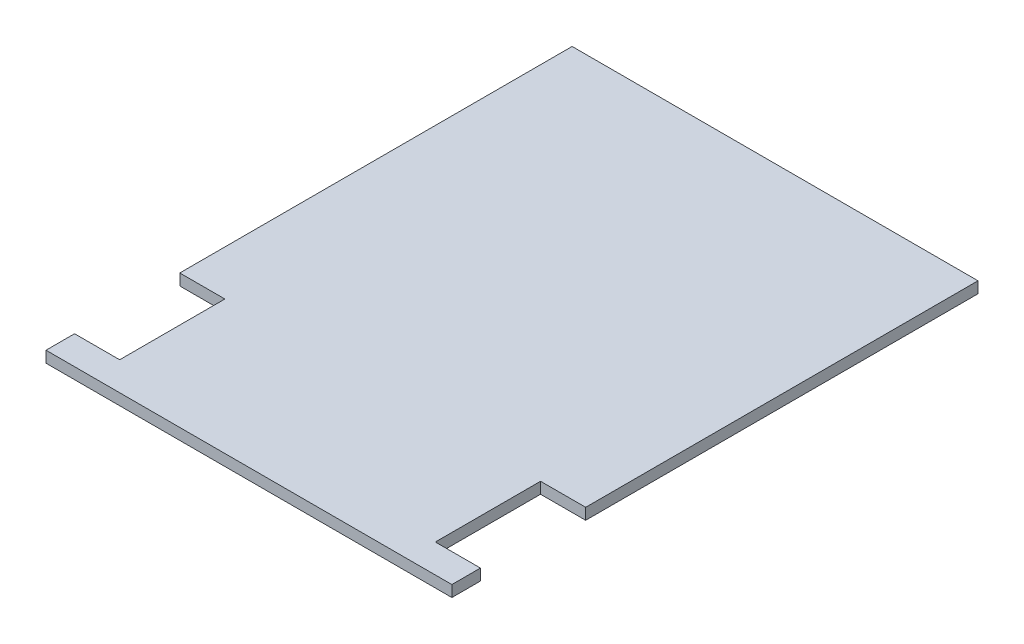
ISO-10303-21;
HEADER;
FILE_DESCRIPTION(('STEP AP214'),'2;1');
FILE_NAME('part.step','',(''),(''),'','','');
FILE_SCHEMA(('AUTOMOTIVE_DESIGN { 1 0 10303 214 1 1 1 1 }'));
ENDSEC;
DATA;
#1=APPLICATION_CONTEXT('core data for automotive mechanical design processes');
#2=APPLICATION_PROTOCOL_DEFINITION('international standard','automotive_design',2000,#1);
#3=PRODUCT_CONTEXT('',#1,'mechanical');
#4=PRODUCT('Part','Part','',(#3));
#5=PRODUCT_RELATED_PRODUCT_CATEGORY('part','',(#4));
#6=PRODUCT_DEFINITION_FORMATION('','',#4);
#7=PRODUCT_DEFINITION_CONTEXT('part definition',#1,'design');
#8=PRODUCT_DEFINITION('design','',#6,#7);
#9=PRODUCT_DEFINITION_SHAPE('','',#8);
#10=(LENGTH_UNIT() NAMED_UNIT(*) SI_UNIT(.MILLI.,.METRE.));
#11=(NAMED_UNIT(*) PLANE_ANGLE_UNIT() SI_UNIT($,.RADIAN.));
#12=(NAMED_UNIT(*) SI_UNIT($,.STERADIAN.) SOLID_ANGLE_UNIT());
#13=UNCERTAINTY_MEASURE_WITH_UNIT(LENGTH_MEASURE(1.E-05),#10,'distance_accuracy_value','');
#14=(GEOMETRIC_REPRESENTATION_CONTEXT(3) GLOBAL_UNCERTAINTY_ASSIGNED_CONTEXT((#13)) GLOBAL_UNIT_ASSIGNED_CONTEXT((#10,
#11,#12)) REPRESENTATION_CONTEXT('',''));
#15=CARTESIAN_POINT('',(0.,0.,0.));
#16=DIRECTION('',(0.,0.,1.));
#17=DIRECTION('',(1.,0.,0.));
#18=AXIS2_PLACEMENT_3D('',#15,#16,#17);
#19=CARTESIAN_POINT('',(-19.3852350722264,0.75,-1.9));
#20=DIRECTION('',(1.,0.,0.));
#21=DIRECTION('',(0.,0.,-1.));
#22=AXIS2_PLACEMENT_3D('',#19,#20,#21);
#23=PLANE('',#22);
#24=DIRECTION('',(0.,0.,1.));
#25=VECTOR('',#24,1.);
#26=CARTESIAN_POINT('',(-19.3852350722264,0.,-1.9));
#27=LINE('',#26,#25);
#28=CARTESIAN_POINT('',(-19.3852350722264,0.,-1.9));
#29=VERTEX_POINT('',#28);
#30=CARTESIAN_POINT('',(-19.3852350722264,0.,0.));
#31=VERTEX_POINT('',#30);
#32=EDGE_CURVE('E153',#29,#31,#27,.T.);
#33=ORIENTED_EDGE('',*,*,#32,.T.);
#34=DIRECTION('',(0.,-1.,0.));
#35=VECTOR('',#34,1.);
#36=CARTESIAN_POINT('',(-19.3852350722264,0.75,0.));
#37=LINE('',#36,#35);
#38=CARTESIAN_POINT('',(-19.3852350722264,0.75,0.));
#39=VERTEX_POINT('',#38);
#40=EDGE_CURVE('E11',#39,#31,#37,.T.);
#41=ORIENTED_EDGE('',*,*,#40,.F.);
#42=DIRECTION('',(0.,0.,1.));
#43=VECTOR('',#42,1.);
#44=CARTESIAN_POINT('',(-19.3852350722264,0.75,-1.9));
#45=LINE('',#44,#43);
#46=CARTESIAN_POINT('',(-19.3852350722264,0.75,-1.9));
#47=VERTEX_POINT('',#46);
#48=EDGE_CURVE('E175',#47,#39,#45,.T.);
#49=ORIENTED_EDGE('',*,*,#48,.F.);
#50=DIRECTION('',(0.,-1.,0.));
#51=VECTOR('',#50,1.);
#52=CARTESIAN_POINT('',(-19.3852350722264,0.75,-1.9));
#53=LINE('',#52,#51);
#54=EDGE_CURVE('E149',#47,#29,#53,.T.);
#55=ORIENTED_EDGE('',*,*,#54,.T.);
#56=EDGE_LOOP('',(#33,#41,#49,#55));
#57=FACE_BOUND('',#56,.T.);
#58=ADVANCED_FACE('F33',(#57),#23,.F.);
#59=CARTESIAN_POINT('',(7.61476492777361,0.75,0.));
#60=DIRECTION('',(0.,0.,-1.));
#61=DIRECTION('',(-1.,0.,0.));
#62=AXIS2_PLACEMENT_3D('',#59,#60,#61);
#63=PLANE('',#62);
#64=DIRECTION('',(1.,0.,0.));
#65=VECTOR('',#64,1.);
#66=CARTESIAN_POINT('',(7.61476492777361,0.,0.));
#67=LINE('',#66,#65);
#68=CARTESIAN_POINT('',(7.61476492777361,0.,0.));
#69=VERTEX_POINT('',#68);
#70=EDGE_CURVE('E156',#31,#69,#67,.T.);
#71=ORIENTED_EDGE('',*,*,#70,.T.);
#72=DIRECTION('',(0.,-1.,0.));
#73=VECTOR('',#72,1.);
#74=CARTESIAN_POINT('',(7.61476492777361,0.75,0.));
#75=LINE('',#74,#73);
#76=CARTESIAN_POINT('',(7.61476492777361,0.75,0.));
#77=VERTEX_POINT('',#76);
#78=EDGE_CURVE('E41',#77,#69,#75,.T.);
#79=ORIENTED_EDGE('',*,*,#78,.F.);
#80=DIRECTION('',(1.,0.,0.));
#81=VECTOR('',#80,1.);
#82=CARTESIAN_POINT('',(7.61476492777361,0.75,0.));
#83=LINE('',#82,#81);
#84=EDGE_CURVE('E104',#39,#77,#83,.T.);
#85=ORIENTED_EDGE('',*,*,#84,.F.);
#86=ORIENTED_EDGE('',*,*,#40,.T.);
#87=EDGE_LOOP('',(#71,#79,#85,#86));
#88=FACE_BOUND('',#87,.T.);
#89=ADVANCED_FACE('F253',(#88),#63,.F.);
#90=CARTESIAN_POINT('',(7.61476492777361,0.75,-1.9));
#91=DIRECTION('',(-1.,0.,0.));
#92=DIRECTION('',(0.,0.,1.));
#93=AXIS2_PLACEMENT_3D('',#90,#91,#92);
#94=PLANE('',#93);
#95=DIRECTION('',(0.,0.,-1.));
#96=VECTOR('',#95,1.);
#97=CARTESIAN_POINT('',(7.61476492777361,0.,-1.9));
#98=LINE('',#97,#96);
#99=CARTESIAN_POINT('',(7.61476492777361,0.,-1.9));
#100=VERTEX_POINT('',#99);
#101=EDGE_CURVE('E158',#69,#100,#98,.T.);
#102=ORIENTED_EDGE('',*,*,#101,.T.);
#103=DIRECTION('',(0.,-1.,0.));
#104=VECTOR('',#103,1.);
#105=CARTESIAN_POINT('',(7.61476492777361,0.75,-1.9));
#106=LINE('',#105,#104);
#107=CARTESIAN_POINT('',(7.61476492777361,0.75,-1.9));
#108=VERTEX_POINT('',#107);
#109=EDGE_CURVE('E194',#108,#100,#106,.T.);
#110=ORIENTED_EDGE('',*,*,#109,.F.);
#111=DIRECTION('',(0.,0.,-1.));
#112=VECTOR('',#111,1.);
#113=CARTESIAN_POINT('',(7.61476492777361,0.75,-1.9));
#114=LINE('',#113,#112);
#115=EDGE_CURVE('E202',#77,#108,#114,.T.);
#116=ORIENTED_EDGE('',*,*,#115,.F.);
#117=ORIENTED_EDGE('',*,*,#78,.T.);
#118=EDGE_LOOP('',(#102,#110,#116,#117));
#119=FACE_BOUND('',#118,.T.);
#120=ADVANCED_FACE('F200',(#119),#94,.F.);
#121=CARTESIAN_POINT('',(4.61476492777361,0.75,-1.9));
#122=DIRECTION('',(0.,0.,1.));
#123=DIRECTION('',(1.,0.,0.));
#124=AXIS2_PLACEMENT_3D('',#121,#122,#123);
#125=PLANE('',#124);
#126=DIRECTION('',(-1.,0.,0.));
#127=VECTOR('',#126,1.);
#128=CARTESIAN_POINT('',(4.61476492777361,0.,-1.9));
#129=LINE('',#128,#127);
#130=CARTESIAN_POINT('',(4.61476492777361,0.,-1.9));
#131=VERTEX_POINT('',#130);
#132=EDGE_CURVE('E160',#100,#131,#129,.T.);
#133=ORIENTED_EDGE('',*,*,#132,.T.);
#134=DIRECTION('',(0.,-1.,0.));
#135=VECTOR('',#134,1.);
#136=CARTESIAN_POINT('',(4.61476492777361,0.75,-1.9));
#137=LINE('',#136,#135);
#138=CARTESIAN_POINT('',(4.61476492777361,0.75,-1.9));
#139=VERTEX_POINT('',#138);
#140=EDGE_CURVE('E191',#139,#131,#137,.T.);
#141=ORIENTED_EDGE('',*,*,#140,.F.);
#142=DIRECTION('',(-1.,0.,0.));
#143=VECTOR('',#142,1.);
#144=CARTESIAN_POINT('',(4.61476492777361,0.75,-1.9));
#145=LINE('',#144,#143);
#146=EDGE_CURVE('E220',#108,#139,#145,.T.);
#147=ORIENTED_EDGE('',*,*,#146,.F.);
#148=ORIENTED_EDGE('',*,*,#109,.T.);
#149=EDGE_LOOP('',(#133,#141,#147,#148));
#150=FACE_BOUND('',#149,.T.);
#151=ADVANCED_FACE('F211',(#150),#125,.F.);
#152=CARTESIAN_POINT('',(4.61476492777361,0.75,-8.9));
#153=DIRECTION('',(-1.,0.,0.));
#154=DIRECTION('',(0.,0.,1.));
#155=AXIS2_PLACEMENT_3D('',#152,#153,#154);
#156=PLANE('',#155);
#157=DIRECTION('',(0.,0.,-1.));
#158=VECTOR('',#157,1.);
#159=CARTESIAN_POINT('',(4.61476492777361,0.,-8.9));
#160=LINE('',#159,#158);
#161=CARTESIAN_POINT('',(4.61476492777361,0.,-8.9));
#162=VERTEX_POINT('',#161);
#163=EDGE_CURVE('E162',#131,#162,#160,.T.);
#164=ORIENTED_EDGE('',*,*,#163,.T.);
#165=DIRECTION('',(0.,-1.,0.));
#166=VECTOR('',#165,1.);
#167=CARTESIAN_POINT('',(4.61476492777361,0.75,-8.9));
#168=LINE('',#167,#166);
#169=CARTESIAN_POINT('',(4.61476492777361,0.75,-8.9));
#170=VERTEX_POINT('',#169);
#171=EDGE_CURVE('E188',#170,#162,#168,.T.);
#172=ORIENTED_EDGE('',*,*,#171,.F.);
#173=DIRECTION('',(0.,0.,-1.));
#174=VECTOR('',#173,1.);
#175=CARTESIAN_POINT('',(4.61476492777361,0.75,-8.9));
#176=LINE('',#175,#174);
#177=EDGE_CURVE('E217',#139,#170,#176,.T.);
#178=ORIENTED_EDGE('',*,*,#177,.F.);
#179=ORIENTED_EDGE('',*,*,#140,.T.);
#180=EDGE_LOOP('',(#164,#172,#178,#179));
#181=FACE_BOUND('',#180,.T.);
#182=ADVANCED_FACE('F215',(#181),#156,.F.);
#183=CARTESIAN_POINT('',(7.61476492777361,0.75,-8.9));
#184=DIRECTION('',(0.,0.,-1.));
#185=DIRECTION('',(-1.,0.,0.));
#186=AXIS2_PLACEMENT_3D('',#183,#184,#185);
#187=PLANE('',#186);
#188=DIRECTION('',(1.,0.,0.));
#189=VECTOR('',#188,1.);
#190=CARTESIAN_POINT('',(7.61476492777361,0.,-8.9));
#191=LINE('',#190,#189);
#192=CARTESIAN_POINT('',(7.61476492777361,0.,-8.9));
#193=VERTEX_POINT('',#192);
#194=EDGE_CURVE('E164',#162,#193,#191,.T.);
#195=ORIENTED_EDGE('',*,*,#194,.T.);
#196=DIRECTION('',(0.,-1.,0.));
#197=VECTOR('',#196,1.);
#198=CARTESIAN_POINT('',(7.61476492777361,0.75,-8.9));
#199=LINE('',#198,#197);
#200=CARTESIAN_POINT('',(7.61476492777361,0.75,-8.9));
#201=VERTEX_POINT('',#200);
#202=EDGE_CURVE('E185',#201,#193,#199,.T.);
#203=ORIENTED_EDGE('',*,*,#202,.F.);
#204=DIRECTION('',(1.,0.,0.));
#205=VECTOR('',#204,1.);
#206=CARTESIAN_POINT('',(7.61476492777361,0.75,-8.9));
#207=LINE('',#206,#205);
#208=EDGE_CURVE('E219',#170,#201,#207,.T.);
#209=ORIENTED_EDGE('',*,*,#208,.F.);
#210=ORIENTED_EDGE('',*,*,#171,.T.);
#211=EDGE_LOOP('',(#195,#203,#209,#210));
#212=FACE_BOUND('',#211,.T.);
#213=ADVANCED_FACE('F266',(#212),#187,.F.);
#214=CARTESIAN_POINT('',(7.6147649277736,0.75,-35.));
#215=DIRECTION('',(-1.,0.,0.));
#216=DIRECTION('',(0.,0.,1.));
#217=AXIS2_PLACEMENT_3D('',#214,#215,#216);
#218=PLANE('',#217);
#219=DIRECTION('',(0.,0.,-1.));
#220=VECTOR('',#219,1.);
#221=CARTESIAN_POINT('',(7.6147649277736,0.,-35.));
#222=LINE('',#221,#220);
#223=CARTESIAN_POINT('',(7.6147649277736,0.,-35.));
#224=VERTEX_POINT('',#223);
#225=EDGE_CURVE('E166',#193,#224,#222,.T.);
#226=ORIENTED_EDGE('',*,*,#225,.T.);
#227=DIRECTION('',(0.,-1.,0.));
#228=VECTOR('',#227,1.);
#229=CARTESIAN_POINT('',(7.6147649277736,0.75,-35.));
#230=LINE('',#229,#228);
#231=CARTESIAN_POINT('',(7.6147649277736,0.75,-35.));
#232=VERTEX_POINT('',#231);
#233=EDGE_CURVE('E182',#232,#224,#230,.T.);
#234=ORIENTED_EDGE('',*,*,#233,.F.);
#235=DIRECTION('',(0.,0.,-1.));
#236=VECTOR('',#235,1.);
#237=CARTESIAN_POINT('',(7.6147649277736,0.75,-35.));
#238=LINE('',#237,#236);
#239=EDGE_CURVE('E222',#201,#232,#238,.T.);
#240=ORIENTED_EDGE('',*,*,#239,.F.);
#241=ORIENTED_EDGE('',*,*,#202,.T.);
#242=EDGE_LOOP('',(#226,#234,#240,#241));
#243=FACE_BOUND('',#242,.T.);
#244=ADVANCED_FACE('F269',(#243),#218,.F.);
#245=CARTESIAN_POINT('',(-19.3852350722264,0.75,-35.));
#246=DIRECTION('',(0.,0.,1.));
#247=DIRECTION('',(1.,0.,0.));
#248=AXIS2_PLACEMENT_3D('',#245,#246,#247);
#249=PLANE('',#248);
#250=DIRECTION('',(-1.,0.,0.));
#251=VECTOR('',#250,1.);
#252=CARTESIAN_POINT('',(-19.3852350722264,0.,-35.));
#253=LINE('',#252,#251);
#254=CARTESIAN_POINT('',(-19.3852350722264,0.,-35.));
#255=VERTEX_POINT('',#254);
#256=EDGE_CURVE('E168',#224,#255,#253,.T.);
#257=ORIENTED_EDGE('',*,*,#256,.T.);
#258=DIRECTION('',(0.,-1.,0.));
#259=VECTOR('',#258,1.);
#260=CARTESIAN_POINT('',(-19.3852350722264,0.75,-35.));
#261=LINE('',#260,#259);
#262=CARTESIAN_POINT('',(-19.3852350722264,0.75,-35.));
#263=VERTEX_POINT('',#262);
#264=EDGE_CURVE('E179',#263,#255,#261,.T.);
#265=ORIENTED_EDGE('',*,*,#264,.F.);
#266=DIRECTION('',(-1.,0.,0.));
#267=VECTOR('',#266,1.);
#268=CARTESIAN_POINT('',(-19.3852350722264,0.75,-35.));
#269=LINE('',#268,#267);
#270=EDGE_CURVE('E228',#232,#263,#269,.T.);
#271=ORIENTED_EDGE('',*,*,#270,.F.);
#272=ORIENTED_EDGE('',*,*,#233,.T.);
#273=EDGE_LOOP('',(#257,#265,#271,#272));
#274=FACE_BOUND('',#273,.T.);
#275=ADVANCED_FACE('F234',(#274),#249,.F.);
#276=CARTESIAN_POINT('',(-19.3852350722264,0.75,-35.));
#277=DIRECTION('',(1.,0.,0.));
#278=DIRECTION('',(0.,0.,-1.));
#279=AXIS2_PLACEMENT_3D('',#276,#277,#278);
#280=PLANE('',#279);
#281=DIRECTION('',(0.,0.,1.));
#282=VECTOR('',#281,1.);
#283=CARTESIAN_POINT('',(-19.3852350722264,0.,-35.));
#284=LINE('',#283,#282);
#285=CARTESIAN_POINT('',(-19.3852350722264,0.,-8.9));
#286=VERTEX_POINT('',#285);
#287=EDGE_CURVE('E170',#255,#286,#284,.T.);
#288=ORIENTED_EDGE('',*,*,#287,.T.);
#289=DIRECTION('',(0.,-1.,0.));
#290=VECTOR('',#289,1.);
#291=CARTESIAN_POINT('',(-19.3852350722264,0.75,-8.9));
#292=LINE('',#291,#290);
#293=CARTESIAN_POINT('',(-19.3852350722264,0.75,-8.9));
#294=VERTEX_POINT('',#293);
#295=EDGE_CURVE('E144',#294,#286,#292,.T.);
#296=ORIENTED_EDGE('',*,*,#295,.F.);
#297=DIRECTION('',(0.,0.,1.));
#298=VECTOR('',#297,1.);
#299=CARTESIAN_POINT('',(-19.3852350722264,0.75,-35.));
#300=LINE('',#299,#298);
#301=EDGE_CURVE('E135',#263,#294,#300,.T.);
#302=ORIENTED_EDGE('',*,*,#301,.F.);
#303=ORIENTED_EDGE('',*,*,#264,.T.);
#304=EDGE_LOOP('',(#288,#296,#302,#303));
#305=FACE_BOUND('',#304,.T.);
#306=ADVANCED_FACE('F238',(#305),#280,.F.);
#307=CARTESIAN_POINT('',(-19.3852350722264,0.75,-8.9));
#308=DIRECTION('',(0.,0.,-1.));
#309=DIRECTION('',(-1.,0.,0.));
#310=AXIS2_PLACEMENT_3D('',#307,#308,#309);
#311=PLANE('',#310);
#312=DIRECTION('',(1.,0.,0.));
#313=VECTOR('',#312,1.);
#314=CARTESIAN_POINT('',(-19.3852350722264,0.,-8.9));
#315=LINE('',#314,#313);
#316=CARTESIAN_POINT('',(-16.3852350722264,0.,-8.9));
#317=VERTEX_POINT('',#316);
#318=EDGE_CURVE('E143',#286,#317,#315,.T.);
#319=ORIENTED_EDGE('',*,*,#318,.T.);
#320=DIRECTION('',(0.,-1.,0.));
#321=VECTOR('',#320,1.);
#322=CARTESIAN_POINT('',(-16.3852350722264,0.75,-8.9));
#323=LINE('',#322,#321);
#324=CARTESIAN_POINT('',(-16.3852350722264,0.75,-8.9));
#325=VERTEX_POINT('',#324);
#326=EDGE_CURVE('E140',#325,#317,#323,.T.);
#327=ORIENTED_EDGE('',*,*,#326,.F.);
#328=DIRECTION('',(1.,0.,0.));
#329=VECTOR('',#328,1.);
#330=CARTESIAN_POINT('',(-19.3852350722264,0.75,-8.9));
#331=LINE('',#330,#329);
#332=EDGE_CURVE('E129',#294,#325,#331,.T.);
#333=ORIENTED_EDGE('',*,*,#332,.F.);
#334=ORIENTED_EDGE('',*,*,#295,.T.);
#335=EDGE_LOOP('',(#319,#327,#333,#334));
#336=FACE_BOUND('',#335,.T.);
#337=ADVANCED_FACE('F141',(#336),#311,.F.);
#338=CARTESIAN_POINT('',(-16.3852350722264,0.75,-8.9));
#339=DIRECTION('',(1.,0.,0.));
#340=DIRECTION('',(0.,0.,-1.));
#341=AXIS2_PLACEMENT_3D('',#338,#339,#340);
#342=PLANE('',#341);
#343=DIRECTION('',(0.,0.,1.));
#344=VECTOR('',#343,1.);
#345=CARTESIAN_POINT('',(-16.3852350722264,0.,-8.9));
#346=LINE('',#345,#344);
#347=CARTESIAN_POINT('',(-16.3852350722264,0.,-1.9));
#348=VERTEX_POINT('',#347);
#349=EDGE_CURVE('E90',#317,#348,#346,.T.);
#350=ORIENTED_EDGE('',*,*,#349,.T.);
#351=DIRECTION('',(0.,-1.,0.));
#352=VECTOR('',#351,1.);
#353=CARTESIAN_POINT('',(-16.3852350722264,0.75,-1.9));
#354=LINE('',#353,#352);
#355=CARTESIAN_POINT('',(-16.3852350722264,0.75,-1.9));
#356=VERTEX_POINT('',#355);
#357=EDGE_CURVE('E145',#356,#348,#354,.T.);
#358=ORIENTED_EDGE('',*,*,#357,.F.);
#359=DIRECTION('',(0.,0.,1.));
#360=VECTOR('',#359,1.);
#361=CARTESIAN_POINT('',(-16.3852350722264,0.75,-8.9));
#362=LINE('',#361,#360);
#363=EDGE_CURVE('E133',#325,#356,#362,.T.);
#364=ORIENTED_EDGE('',*,*,#363,.F.);
#365=ORIENTED_EDGE('',*,*,#326,.T.);
#366=EDGE_LOOP('',(#350,#358,#364,#365));
#367=FACE_BOUND('',#366,.T.);
#368=ADVANCED_FACE('F147',(#367),#342,.F.);
#369=CARTESIAN_POINT('',(-16.3852350722264,0.75,-1.9));
#370=DIRECTION('',(0.,0.,1.));
#371=DIRECTION('',(1.,0.,0.));
#372=AXIS2_PLACEMENT_3D('',#369,#370,#371);
#373=PLANE('',#372);
#374=DIRECTION('',(-1.,0.,0.));
#375=VECTOR('',#374,1.);
#376=CARTESIAN_POINT('',(-16.3852350722264,0.,-1.9));
#377=LINE('',#376,#375);
#378=EDGE_CURVE('E96',#348,#29,#377,.T.);
#379=ORIENTED_EDGE('',*,*,#378,.T.);
#380=ORIENTED_EDGE('',*,*,#54,.F.);
#381=DIRECTION('',(-1.,0.,0.));
#382=VECTOR('',#381,1.);
#383=CARTESIAN_POINT('',(-16.3852350722264,0.75,-1.9));
#384=LINE('',#383,#382);
#385=EDGE_CURVE('E49',#356,#47,#384,.T.);
#386=ORIENTED_EDGE('',*,*,#385,.F.);
#387=ORIENTED_EDGE('',*,*,#357,.T.);
#388=EDGE_LOOP('',(#379,#380,#386,#387));
#389=FACE_BOUND('',#388,.T.);
#390=ADVANCED_FACE('F242',(#389),#373,.F.);
#391=CARTESIAN_POINT('',(0.,0.75,0.));
#392=DIRECTION('',(0.,-1.,0.));
#393=DIRECTION('',(0.,0.,-1.));
#394=AXIS2_PLACEMENT_3D('',#391,#392,#393);
#395=PLANE('',#394);
#396=ORIENTED_EDGE('',*,*,#48,.T.);
#397=ORIENTED_EDGE('',*,*,#84,.T.);
#398=ORIENTED_EDGE('',*,*,#115,.T.);
#399=ORIENTED_EDGE('',*,*,#146,.T.);
#400=ORIENTED_EDGE('',*,*,#177,.T.);
#401=ORIENTED_EDGE('',*,*,#208,.T.);
#402=ORIENTED_EDGE('',*,*,#239,.T.);
#403=ORIENTED_EDGE('',*,*,#270,.T.);
#404=ORIENTED_EDGE('',*,*,#301,.T.);
#405=ORIENTED_EDGE('',*,*,#332,.T.);
#406=ORIENTED_EDGE('',*,*,#363,.T.);
#407=ORIENTED_EDGE('',*,*,#385,.T.);
#408=EDGE_LOOP('',(#396,#397,#398,#399,#400,#401,#402,#403,#404,#405,#406,#407));
#409=FACE_BOUND('',#408,.T.);
#410=ADVANCED_FACE('F131',(#409),#395,.F.);
#411=CARTESIAN_POINT('',(0.,0.,0.));
#412=DIRECTION('',(0.,-1.,0.));
#413=DIRECTION('',(0.,0.,-1.));
#414=AXIS2_PLACEMENT_3D('',#411,#412,#413);
#415=PLANE('',#414);
#416=ORIENTED_EDGE('',*,*,#32,.F.);
#417=ORIENTED_EDGE('',*,*,#378,.F.);
#418=ORIENTED_EDGE('',*,*,#349,.F.);
#419=ORIENTED_EDGE('',*,*,#318,.F.);
#420=ORIENTED_EDGE('',*,*,#287,.F.);
#421=ORIENTED_EDGE('',*,*,#256,.F.);
#422=ORIENTED_EDGE('',*,*,#225,.F.);
#423=ORIENTED_EDGE('',*,*,#194,.F.);
#424=ORIENTED_EDGE('',*,*,#163,.F.);
#425=ORIENTED_EDGE('',*,*,#132,.F.);
#426=ORIENTED_EDGE('',*,*,#101,.F.);
#427=ORIENTED_EDGE('',*,*,#70,.F.);
#428=EDGE_LOOP('',(#416,#417,#418,#419,#420,#421,#422,#423,#424,#425,#426,#427));
#429=FACE_BOUND('',#428,.T.);
#430=ADVANCED_FACE('F206',(#429),#415,.T.);
#431=CLOSED_SHELL('',(#58,#89,#120,#151,#182,#213,#244,#275,#306,#337,#368,#390,#410,#430));
#432=MANIFOLD_SOLID_BREP('B2',#431);
#433=ADVANCED_BREP_SHAPE_REPRESENTATION('',(#18,#432),#14);
#434=SHAPE_DEFINITION_REPRESENTATION(#9,#433);
ENDSEC;
END-ISO-10303-21;
